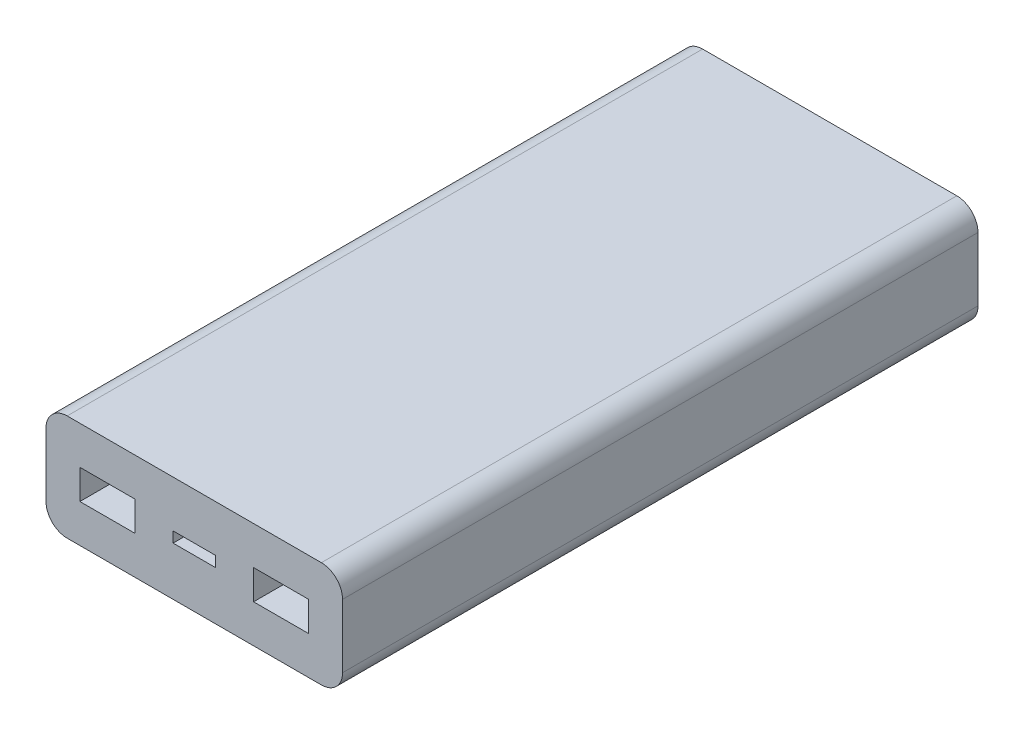
ISO-10303-21;
HEADER;
FILE_DESCRIPTION(('STEP AP214'),'2;1');
FILE_NAME('part.step','',(''),(''),'','','');
FILE_SCHEMA(('AUTOMOTIVE_DESIGN { 1 0 10303 214 1 1 1 1 }'));
ENDSEC;
DATA;
#1=APPLICATION_CONTEXT('core data for automotive mechanical design processes');
#2=APPLICATION_PROTOCOL_DEFINITION('international standard','automotive_design',2000,#1);
#3=PRODUCT_CONTEXT('',#1,'mechanical');
#4=PRODUCT('Part','Part','',(#3));
#5=PRODUCT_RELATED_PRODUCT_CATEGORY('part','',(#4));
#6=PRODUCT_DEFINITION_FORMATION('','',#4);
#7=PRODUCT_DEFINITION_CONTEXT('part definition',#1,'design');
#8=PRODUCT_DEFINITION('design','',#6,#7);
#9=PRODUCT_DEFINITION_SHAPE('','',#8);
#10=(LENGTH_UNIT() NAMED_UNIT(*) SI_UNIT(.MILLI.,.METRE.));
#11=(NAMED_UNIT(*) PLANE_ANGLE_UNIT() SI_UNIT($,.RADIAN.));
#12=(NAMED_UNIT(*) SI_UNIT($,.STERADIAN.) SOLID_ANGLE_UNIT());
#13=UNCERTAINTY_MEASURE_WITH_UNIT(LENGTH_MEASURE(1.E-05),#10,'distance_accuracy_value','');
#14=(GEOMETRIC_REPRESENTATION_CONTEXT(3) GLOBAL_UNCERTAINTY_ASSIGNED_CONTEXT((#13)) GLOBAL_UNIT_ASSIGNED_CONTEXT((#10,
#11,#12)) REPRESENTATION_CONTEXT('',''));
#15=CARTESIAN_POINT('',(0.,0.,0.));
#16=DIRECTION('',(0.,0.,1.));
#17=DIRECTION('',(1.,0.,0.));
#18=AXIS2_PLACEMENT_3D('',#15,#16,#17);
#19=CARTESIAN_POINT('',(0.,0.,150.));
#20=DIRECTION('',(1.,0.,0.));
#21=DIRECTION('',(0.,0.,-1.));
#22=AXIS2_PLACEMENT_3D('',#19,#20,#21);
#23=PLANE('',#22);
#24=DIRECTION('',(0.,-1.,0.));
#25=VECTOR('',#24,1.);
#26=CARTESIAN_POINT('',(0.,0.,0.));
#27=LINE('',#26,#25);
#28=CARTESIAN_POINT('',(0.,20.,0.));
#29=VERTEX_POINT('',#28);
#30=CARTESIAN_POINT('',(0.,5.,0.));
#31=VERTEX_POINT('',#30);
#32=EDGE_CURVE('E208',#29,#31,#27,.T.);
#33=ORIENTED_EDGE('',*,*,#32,.T.);
#34=DIRECTION('',(0.,0.,-1.));
#35=VECTOR('',#34,1.);
#36=CARTESIAN_POINT('',(0.,5.,150.));
#37=LINE('',#36,#35);
#38=CARTESIAN_POINT('',(0.,5.,150.));
#39=VERTEX_POINT('',#38);
#40=EDGE_CURVE('E312',#31,#39,#37,.F.);
#41=ORIENTED_EDGE('',*,*,#40,.T.);
#42=DIRECTION('',(0.,-1.,0.));
#43=VECTOR('',#42,1.);
#44=CARTESIAN_POINT('',(0.,0.,150.));
#45=LINE('',#44,#43);
#46=CARTESIAN_POINT('',(0.,20.,150.));
#47=VERTEX_POINT('',#46);
#48=EDGE_CURVE('E273',#47,#39,#45,.T.);
#49=ORIENTED_EDGE('',*,*,#48,.F.);
#50=DIRECTION('',(0.,0.,-1.));
#51=VECTOR('',#50,1.);
#52=CARTESIAN_POINT('',(0.,20.,150.));
#53=LINE('',#52,#51);
#54=EDGE_CURVE('E309',#47,#29,#53,.T.);
#55=ORIENTED_EDGE('',*,*,#54,.T.);
#56=EDGE_LOOP('',(#33,#41,#49,#55));
#57=FACE_BOUND('',#56,.T.);
#58=ADVANCED_FACE('F35',(#57),#23,.F.);
#59=CARTESIAN_POINT('',(0.,0.,150.));
#60=DIRECTION('',(0.,1.,0.));
#61=DIRECTION('',(0.,0.,1.));
#62=AXIS2_PLACEMENT_3D('',#59,#60,#61);
#63=PLANE('',#62);
#64=DIRECTION('',(1.,0.,0.));
#65=VECTOR('',#64,1.);
#66=CARTESIAN_POINT('',(0.,0.,150.));
#67=LINE('',#66,#65);
#68=CARTESIAN_POINT('',(5.,0.,150.));
#69=VERTEX_POINT('',#68);
#70=CARTESIAN_POINT('',(65.,0.,150.));
#71=VERTEX_POINT('',#70);
#72=EDGE_CURVE('E276',#69,#71,#67,.T.);
#73=ORIENTED_EDGE('',*,*,#72,.F.);
#74=DIRECTION('',(0.,0.,-1.));
#75=VECTOR('',#74,1.);
#76=CARTESIAN_POINT('',(5.,0.,150.));
#77=LINE('',#76,#75);
#78=CARTESIAN_POINT('',(5.,0.,0.));
#79=VERTEX_POINT('',#78);
#80=EDGE_CURVE('E298',#69,#79,#77,.T.);
#81=ORIENTED_EDGE('',*,*,#80,.T.);
#82=DIRECTION('',(1.,0.,0.));
#83=VECTOR('',#82,1.);
#84=CARTESIAN_POINT('',(0.,0.,0.));
#85=LINE('',#84,#83);
#86=CARTESIAN_POINT('',(65.,0.,0.));
#87=VERTEX_POINT('',#86);
#88=EDGE_CURVE('E289',#79,#87,#85,.T.);
#89=ORIENTED_EDGE('',*,*,#88,.T.);
#90=DIRECTION('',(0.,0.,-1.));
#91=VECTOR('',#90,1.);
#92=CARTESIAN_POINT('',(65.,0.,150.));
#93=LINE('',#92,#91);
#94=EDGE_CURVE('E286',#87,#71,#93,.F.);
#95=ORIENTED_EDGE('',*,*,#94,.T.);
#96=EDGE_LOOP('',(#73,#81,#89,#95));
#97=FACE_BOUND('',#96,.T.);
#98=ADVANCED_FACE('F351',(#97),#63,.F.);
#99=CARTESIAN_POINT('',(70.,0.,150.));
#100=DIRECTION('',(-1.,0.,0.));
#101=DIRECTION('',(0.,0.,1.));
#102=AXIS2_PLACEMENT_3D('',#99,#100,#101);
#103=PLANE('',#102);
#104=DIRECTION('',(0.,1.,0.));
#105=VECTOR('',#104,1.);
#106=CARTESIAN_POINT('',(70.,0.,150.));
#107=LINE('',#106,#105);
#108=CARTESIAN_POINT('',(70.,5.,150.));
#109=VERTEX_POINT('',#108);
#110=CARTESIAN_POINT('',(70.,20.,150.));
#111=VERTEX_POINT('',#110);
#112=EDGE_CURVE('E280',#109,#111,#107,.T.);
#113=ORIENTED_EDGE('',*,*,#112,.F.);
#114=DIRECTION('',(0.,0.,-1.));
#115=VECTOR('',#114,1.);
#116=CARTESIAN_POINT('',(70.,5.,150.));
#117=LINE('',#116,#115);
#118=CARTESIAN_POINT('',(70.,5.,0.));
#119=VERTEX_POINT('',#118);
#120=EDGE_CURVE('E324',#109,#119,#117,.T.);
#121=ORIENTED_EDGE('',*,*,#120,.T.);
#122=DIRECTION('',(0.,1.,0.));
#123=VECTOR('',#122,1.);
#124=CARTESIAN_POINT('',(70.,0.,0.));
#125=LINE('',#124,#123);
#126=CARTESIAN_POINT('',(70.,20.,0.));
#127=VERTEX_POINT('',#126);
#128=EDGE_CURVE('E292',#119,#127,#125,.T.);
#129=ORIENTED_EDGE('',*,*,#128,.T.);
#130=DIRECTION('',(0.,0.,-1.));
#131=VECTOR('',#130,1.);
#132=CARTESIAN_POINT('',(70.,20.,150.));
#133=LINE('',#132,#131);
#134=EDGE_CURVE('E322',#127,#111,#133,.F.);
#135=ORIENTED_EDGE('',*,*,#134,.T.);
#136=EDGE_LOOP('',(#113,#121,#129,#135));
#137=FACE_BOUND('',#136,.T.);
#138=ADVANCED_FACE('F360',(#137),#103,.F.);
#139=CARTESIAN_POINT('',(0.,25.,150.));
#140=DIRECTION('',(0.,-1.,0.));
#141=DIRECTION('',(0.,0.,-1.));
#142=AXIS2_PLACEMENT_3D('',#139,#140,#141);
#143=PLANE('',#142);
#144=DIRECTION('',(-1.,0.,0.));
#145=VECTOR('',#144,1.);
#146=CARTESIAN_POINT('',(0.,25.,150.));
#147=LINE('',#146,#145);
#148=CARTESIAN_POINT('',(65.,25.,150.));
#149=VERTEX_POINT('',#148);
#150=CARTESIAN_POINT('',(5.,25.,150.));
#151=VERTEX_POINT('',#150);
#152=EDGE_CURVE('E283',#149,#151,#147,.T.);
#153=ORIENTED_EDGE('',*,*,#152,.F.);
#154=DIRECTION('',(0.,0.,-1.));
#155=VECTOR('',#154,1.);
#156=CARTESIAN_POINT('',(65.,25.,150.));
#157=LINE('',#156,#155);
#158=CARTESIAN_POINT('',(65.,25.,0.));
#159=VERTEX_POINT('',#158);
#160=EDGE_CURVE('E11',#149,#159,#157,.T.);
#161=ORIENTED_EDGE('',*,*,#160,.T.);
#162=DIRECTION('',(-1.,0.,0.));
#163=VECTOR('',#162,1.);
#164=CARTESIAN_POINT('',(0.,25.,0.));
#165=LINE('',#164,#163);
#166=CARTESIAN_POINT('',(5.,25.,0.));
#167=VERTEX_POINT('',#166);
#168=EDGE_CURVE('E277',#159,#167,#165,.T.);
#169=ORIENTED_EDGE('',*,*,#168,.T.);
#170=DIRECTION('',(0.,0.,-1.));
#171=VECTOR('',#170,1.);
#172=CARTESIAN_POINT('',(5.,25.,150.));
#173=LINE('',#172,#171);
#174=EDGE_CURVE('E43',#167,#151,#173,.F.);
#175=ORIENTED_EDGE('',*,*,#174,.T.);
#176=EDGE_LOOP('',(#153,#161,#169,#175));
#177=FACE_BOUND('',#176,.T.);
#178=ADVANCED_FACE('F329',(#177),#143,.F.);
#179=CARTESIAN_POINT('',(0.,0.,150.));
#180=DIRECTION('',(0.,0.,-1.));
#181=DIRECTION('',(-1.,0.,0.));
#182=AXIS2_PLACEMENT_3D('',#179,#180,#181);
#183=PLANE('',#182);
#184=DIRECTION('',(1.,0.,0.));
#185=VECTOR('',#184,1.);
#186=CARTESIAN_POINT('',(8.,9.,150.));
#187=LINE('',#186,#185);
#188=CARTESIAN_POINT('',(8.,9.,150.));
#189=VERTEX_POINT('',#188);
#190=CARTESIAN_POINT('',(21.,9.,150.));
#191=VERTEX_POINT('',#190);
#192=EDGE_CURVE('E201',#189,#191,#187,.T.);
#193=ORIENTED_EDGE('',*,*,#192,.F.);
#194=DIRECTION('',(0.,-1.,0.));
#195=VECTOR('',#194,1.);
#196=CARTESIAN_POINT('',(8.,16.,150.));
#197=LINE('',#196,#195);
#198=CARTESIAN_POINT('',(8.,16.,150.));
#199=VERTEX_POINT('',#198);
#200=EDGE_CURVE('E50',#199,#189,#197,.T.);
#201=ORIENTED_EDGE('',*,*,#200,.F.);
#202=DIRECTION('',(-1.,0.,0.));
#203=VECTOR('',#202,1.);
#204=CARTESIAN_POINT('',(8.,16.,150.));
#205=LINE('',#204,#203);
#206=CARTESIAN_POINT('',(21.,16.,150.));
#207=VERTEX_POINT('',#206);
#208=EDGE_CURVE('E192',#207,#199,#205,.T.);
#209=ORIENTED_EDGE('',*,*,#208,.F.);
#210=DIRECTION('',(0.,1.,0.));
#211=VECTOR('',#210,1.);
#212=CARTESIAN_POINT('',(21.,16.,150.));
#213=LINE('',#212,#211);
#214=EDGE_CURVE('E195',#191,#207,#213,.T.);
#215=ORIENTED_EDGE('',*,*,#214,.F.);
#216=EDGE_LOOP('',(#193,#201,#209,#215));
#217=FACE_BOUND('',#216,.T.);
#218=DIRECTION('',(1.,0.,0.));
#219=VECTOR('',#218,1.);
#220=CARTESIAN_POINT('',(49.,9.,150.));
#221=LINE('',#220,#219);
#222=CARTESIAN_POINT('',(49.,9.,150.));
#223=VERTEX_POINT('',#222);
#224=CARTESIAN_POINT('',(62.,9.,150.));
#225=VERTEX_POINT('',#224);
#226=EDGE_CURVE('E227',#223,#225,#221,.T.);
#227=ORIENTED_EDGE('',*,*,#226,.F.);
#228=DIRECTION('',(0.,-1.,0.));
#229=VECTOR('',#228,1.);
#230=CARTESIAN_POINT('',(49.,16.,150.));
#231=LINE('',#230,#229);
#232=CARTESIAN_POINT('',(49.,16.,150.));
#233=VERTEX_POINT('',#232);
#234=EDGE_CURVE('E58',#233,#223,#231,.T.);
#235=ORIENTED_EDGE('',*,*,#234,.F.);
#236=DIRECTION('',(-1.,0.,0.));
#237=VECTOR('',#236,1.);
#238=CARTESIAN_POINT('',(49.,16.,150.));
#239=LINE('',#238,#237);
#240=CARTESIAN_POINT('',(62.,16.,150.));
#241=VERTEX_POINT('',#240);
#242=EDGE_CURVE('E216',#241,#233,#239,.T.);
#243=ORIENTED_EDGE('',*,*,#242,.F.);
#244=DIRECTION('',(0.,1.,0.));
#245=VECTOR('',#244,1.);
#246=CARTESIAN_POINT('',(62.,16.,150.));
#247=LINE('',#246,#245);
#248=EDGE_CURVE('E231',#225,#241,#247,.T.);
#249=ORIENTED_EDGE('',*,*,#248,.F.);
#250=EDGE_LOOP('',(#227,#235,#243,#249));
#251=FACE_BOUND('',#250,.T.);
#252=DIRECTION('',(1.,0.,0.));
#253=VECTOR('',#252,1.);
#254=CARTESIAN_POINT('',(30.,11.5,150.));
#255=LINE('',#254,#253);
#256=CARTESIAN_POINT('',(30.,11.5,150.));
#257=VERTEX_POINT('',#256);
#258=CARTESIAN_POINT('',(40.,11.5,150.));
#259=VERTEX_POINT('',#258);
#260=EDGE_CURVE('E258',#257,#259,#255,.T.);
#261=ORIENTED_EDGE('',*,*,#260,.F.);
#262=DIRECTION('',(0.,-1.,0.));
#263=VECTOR('',#262,1.);
#264=CARTESIAN_POINT('',(30.,14.,150.));
#265=LINE('',#264,#263);
#266=CARTESIAN_POINT('',(30.,14.,150.));
#267=VERTEX_POINT('',#266);
#268=EDGE_CURVE('E256',#267,#257,#265,.T.);
#269=ORIENTED_EDGE('',*,*,#268,.F.);
#270=DIRECTION('',(-1.,0.,0.));
#271=VECTOR('',#270,1.);
#272=CARTESIAN_POINT('',(30.,14.,150.));
#273=LINE('',#272,#271);
#274=CARTESIAN_POINT('',(40.,14.,150.));
#275=VERTEX_POINT('',#274);
#276=EDGE_CURVE('E246',#275,#267,#273,.T.);
#277=ORIENTED_EDGE('',*,*,#276,.F.);
#278=DIRECTION('',(0.,1.,0.));
#279=VECTOR('',#278,1.);
#280=CARTESIAN_POINT('',(40.,14.,150.));
#281=LINE('',#280,#279);
#282=EDGE_CURVE('E261',#259,#275,#281,.T.);
#283=ORIENTED_EDGE('',*,*,#282,.F.);
#284=EDGE_LOOP('',(#261,#269,#277,#283));
#285=FACE_BOUND('',#284,.T.);
#286=ORIENTED_EDGE('',*,*,#48,.T.);
#287=CARTESIAN_POINT('',(5.,5.,150.));
#288=DIRECTION('',(0.,0.,-1.));
#289=DIRECTION('',(-1.,0.,0.));
#290=AXIS2_PLACEMENT_3D('',#287,#288,#289);
#291=CIRCLE('',#290,5.);
#292=EDGE_CURVE('E320',#39,#69,#291,.F.);
#293=ORIENTED_EDGE('',*,*,#292,.T.);
#294=ORIENTED_EDGE('',*,*,#72,.T.);
#295=CARTESIAN_POINT('',(65.,5.,150.));
#296=DIRECTION('',(0.,0.,-1.));
#297=DIRECTION('',(-1.,0.,0.));
#298=AXIS2_PLACEMENT_3D('',#295,#296,#297);
#299=CIRCLE('',#298,5.);
#300=EDGE_CURVE('E318',#71,#109,#299,.F.);
#301=ORIENTED_EDGE('',*,*,#300,.T.);
#302=ORIENTED_EDGE('',*,*,#112,.T.);
#303=CARTESIAN_POINT('',(65.,20.,150.));
#304=DIRECTION('',(0.,0.,-1.));
#305=DIRECTION('',(-1.,0.,0.));
#306=AXIS2_PLACEMENT_3D('',#303,#304,#305);
#307=CIRCLE('',#306,5.);
#308=EDGE_CURVE('E316',#111,#149,#307,.F.);
#309=ORIENTED_EDGE('',*,*,#308,.T.);
#310=ORIENTED_EDGE('',*,*,#152,.T.);
#311=CARTESIAN_POINT('',(5.,20.,150.));
#312=DIRECTION('',(0.,0.,-1.));
#313=DIRECTION('',(-1.,0.,0.));
#314=AXIS2_PLACEMENT_3D('',#311,#312,#313);
#315=CIRCLE('',#314,5.);
#316=EDGE_CURVE('E314',#151,#47,#315,.F.);
#317=ORIENTED_EDGE('',*,*,#316,.T.);
#318=EDGE_LOOP('',(#286,#293,#294,#301,#302,#309,#310,#317));
#319=FACE_BOUND('',#318,.T.);
#320=ADVANCED_FACE('F335',(#217,#251,#285,#319),#183,.F.);
#321=CARTESIAN_POINT('',(0.,0.,0.));
#322=DIRECTION('',(0.,0.,-1.));
#323=DIRECTION('',(-1.,0.,0.));
#324=AXIS2_PLACEMENT_3D('',#321,#322,#323);
#325=PLANE('',#324);
#326=ORIENTED_EDGE('',*,*,#88,.F.);
#327=CARTESIAN_POINT('',(5.,5.,0.));
#328=DIRECTION('',(0.,0.,-1.));
#329=DIRECTION('',(-1.,0.,0.));
#330=AXIS2_PLACEMENT_3D('',#327,#328,#329);
#331=CIRCLE('',#330,5.);
#332=EDGE_CURVE('E307',#79,#31,#331,.T.);
#333=ORIENTED_EDGE('',*,*,#332,.T.);
#334=ORIENTED_EDGE('',*,*,#32,.F.);
#335=CARTESIAN_POINT('',(5.,20.,0.));
#336=DIRECTION('',(0.,0.,-1.));
#337=DIRECTION('',(-1.,0.,0.));
#338=AXIS2_PLACEMENT_3D('',#335,#336,#337);
#339=CIRCLE('',#338,5.);
#340=EDGE_CURVE('E301',#29,#167,#339,.T.);
#341=ORIENTED_EDGE('',*,*,#340,.T.);
#342=ORIENTED_EDGE('',*,*,#168,.F.);
#343=CARTESIAN_POINT('',(65.,20.,0.));
#344=DIRECTION('',(0.,0.,-1.));
#345=DIRECTION('',(-1.,0.,0.));
#346=AXIS2_PLACEMENT_3D('',#343,#344,#345);
#347=CIRCLE('',#346,5.);
#348=EDGE_CURVE('E303',#159,#127,#347,.T.);
#349=ORIENTED_EDGE('',*,*,#348,.T.);
#350=ORIENTED_EDGE('',*,*,#128,.F.);
#351=CARTESIAN_POINT('',(65.,5.,0.));
#352=DIRECTION('',(0.,0.,-1.));
#353=DIRECTION('',(-1.,0.,0.));
#354=AXIS2_PLACEMENT_3D('',#351,#352,#353);
#355=CIRCLE('',#354,5.);
#356=EDGE_CURVE('E305',#119,#87,#355,.T.);
#357=ORIENTED_EDGE('',*,*,#356,.T.);
#358=EDGE_LOOP('',(#326,#333,#334,#341,#342,#349,#350,#357));
#359=FACE_BOUND('',#358,.T.);
#360=ADVANCED_FACE('F344',(#359),#325,.T.);
#361=CARTESIAN_POINT('',(5.,5.,150.));
#362=DIRECTION('',(0.,0.,-1.));
#363=DIRECTION('',(-1.,0.,0.));
#364=AXIS2_PLACEMENT_3D('',#361,#362,#363);
#365=CYLINDRICAL_SURFACE('',#364,5.);
#366=ORIENTED_EDGE('',*,*,#292,.F.);
#367=ORIENTED_EDGE('',*,*,#40,.F.);
#368=ORIENTED_EDGE('',*,*,#332,.F.);
#369=ORIENTED_EDGE('',*,*,#80,.F.);
#370=EDGE_LOOP('',(#366,#367,#368,#369));
#371=FACE_BOUND('',#370,.T.);
#372=ADVANCED_FACE('F348',(#371),#365,.T.);
#373=CARTESIAN_POINT('',(65.,5.,150.));
#374=DIRECTION('',(0.,0.,-1.));
#375=DIRECTION('',(-1.,0.,0.));
#376=AXIS2_PLACEMENT_3D('',#373,#374,#375);
#377=CYLINDRICAL_SURFACE('',#376,5.);
#378=ORIENTED_EDGE('',*,*,#300,.F.);
#379=ORIENTED_EDGE('',*,*,#94,.F.);
#380=ORIENTED_EDGE('',*,*,#356,.F.);
#381=ORIENTED_EDGE('',*,*,#120,.F.);
#382=EDGE_LOOP('',(#378,#379,#380,#381));
#383=FACE_BOUND('',#382,.T.);
#384=ADVANCED_FACE('F357',(#383),#377,.T.);
#385=CARTESIAN_POINT('',(65.,20.,150.));
#386=DIRECTION('',(0.,0.,-1.));
#387=DIRECTION('',(-1.,0.,0.));
#388=AXIS2_PLACEMENT_3D('',#385,#386,#387);
#389=CYLINDRICAL_SURFACE('',#388,5.);
#390=ORIENTED_EDGE('',*,*,#308,.F.);
#391=ORIENTED_EDGE('',*,*,#134,.F.);
#392=ORIENTED_EDGE('',*,*,#348,.F.);
#393=ORIENTED_EDGE('',*,*,#160,.F.);
#394=EDGE_LOOP('',(#390,#391,#392,#393));
#395=FACE_BOUND('',#394,.T.);
#396=ADVANCED_FACE('F363',(#395),#389,.T.);
#397=CARTESIAN_POINT('',(5.,20.,150.));
#398=DIRECTION('',(0.,0.,-1.));
#399=DIRECTION('',(-1.,0.,0.));
#400=AXIS2_PLACEMENT_3D('',#397,#398,#399);
#401=CYLINDRICAL_SURFACE('',#400,5.);
#402=ORIENTED_EDGE('',*,*,#316,.F.);
#403=ORIENTED_EDGE('',*,*,#174,.F.);
#404=ORIENTED_EDGE('',*,*,#340,.F.);
#405=ORIENTED_EDGE('',*,*,#54,.F.);
#406=EDGE_LOOP('',(#402,#403,#404,#405));
#407=FACE_BOUND('',#406,.T.);
#408=ADVANCED_FACE('F37',(#407),#401,.T.);
#409=CARTESIAN_POINT('',(30.,14.,138.5));
#410=DIRECTION('',(-1.,0.,0.));
#411=DIRECTION('',(0.,0.,1.));
#412=AXIS2_PLACEMENT_3D('',#409,#410,#411);
#413=PLANE('',#412);
#414=ORIENTED_EDGE('',*,*,#268,.T.);
#415=DIRECTION('',(0.,0.,1.));
#416=VECTOR('',#415,1.);
#417=CARTESIAN_POINT('',(30.,11.5,138.5));
#418=LINE('',#417,#416);
#419=CARTESIAN_POINT('',(30.,11.5,138.5));
#420=VERTEX_POINT('',#419);
#421=EDGE_CURVE('E255',#420,#257,#418,.T.);
#422=ORIENTED_EDGE('',*,*,#421,.F.);
#423=DIRECTION('',(0.,-1.,0.));
#424=VECTOR('',#423,1.);
#425=CARTESIAN_POINT('',(30.,14.,138.5));
#426=LINE('',#425,#424);
#427=CARTESIAN_POINT('',(30.,14.,138.5));
#428=VERTEX_POINT('',#427);
#429=EDGE_CURVE('E242',#428,#420,#426,.T.);
#430=ORIENTED_EDGE('',*,*,#429,.F.);
#431=DIRECTION('',(0.,0.,1.));
#432=VECTOR('',#431,1.);
#433=CARTESIAN_POINT('',(30.,14.,138.5));
#434=LINE('',#433,#432);
#435=EDGE_CURVE('E228',#428,#267,#434,.T.);
#436=ORIENTED_EDGE('',*,*,#435,.T.);
#437=EDGE_LOOP('',(#414,#422,#430,#436));
#438=FACE_BOUND('',#437,.T.);
#439=ADVANCED_FACE('F369',(#438),#413,.F.);
#440=CARTESIAN_POINT('',(30.,14.,138.5));
#441=DIRECTION('',(0.,1.,0.));
#442=DIRECTION('',(0.,0.,1.));
#443=AXIS2_PLACEMENT_3D('',#440,#441,#442);
#444=PLANE('',#443);
#445=ORIENTED_EDGE('',*,*,#276,.T.);
#446=ORIENTED_EDGE('',*,*,#435,.F.);
#447=DIRECTION('',(-1.,0.,0.));
#448=VECTOR('',#447,1.);
#449=CARTESIAN_POINT('',(30.,14.,138.5));
#450=LINE('',#449,#448);
#451=CARTESIAN_POINT('',(40.,14.,138.5));
#452=VERTEX_POINT('',#451);
#453=EDGE_CURVE('E252',#452,#428,#450,.T.);
#454=ORIENTED_EDGE('',*,*,#453,.F.);
#455=DIRECTION('',(0.,0.,1.));
#456=VECTOR('',#455,1.);
#457=CARTESIAN_POINT('',(40.,14.,138.5));
#458=LINE('',#457,#456);
#459=EDGE_CURVE('E267',#452,#275,#458,.T.);
#460=ORIENTED_EDGE('',*,*,#459,.T.);
#461=EDGE_LOOP('',(#445,#446,#454,#460));
#462=FACE_BOUND('',#461,.T.);
#463=ADVANCED_FACE('F418',(#462),#444,.F.);
#464=CARTESIAN_POINT('',(40.,14.,138.5));
#465=DIRECTION('',(1.,0.,0.));
#466=DIRECTION('',(0.,0.,-1.));
#467=AXIS2_PLACEMENT_3D('',#464,#465,#466);
#468=PLANE('',#467);
#469=ORIENTED_EDGE('',*,*,#282,.T.);
#470=ORIENTED_EDGE('',*,*,#459,.F.);
#471=DIRECTION('',(0.,1.,0.));
#472=VECTOR('',#471,1.);
#473=CARTESIAN_POINT('',(40.,14.,138.5));
#474=LINE('',#473,#472);
#475=CARTESIAN_POINT('',(40.,11.5,138.5));
#476=VERTEX_POINT('',#475);
#477=EDGE_CURVE('E249',#476,#452,#474,.T.);
#478=ORIENTED_EDGE('',*,*,#477,.F.);
#479=DIRECTION('',(0.,0.,1.));
#480=VECTOR('',#479,1.);
#481=CARTESIAN_POINT('',(40.,11.5,138.5));
#482=LINE('',#481,#480);
#483=EDGE_CURVE('E269',#476,#259,#482,.T.);
#484=ORIENTED_EDGE('',*,*,#483,.T.);
#485=EDGE_LOOP('',(#469,#470,#478,#484));
#486=FACE_BOUND('',#485,.T.);
#487=ADVANCED_FACE('F427',(#486),#468,.F.);
#488=CARTESIAN_POINT('',(30.,11.5,138.5));
#489=DIRECTION('',(0.,-1.,0.));
#490=DIRECTION('',(1.,0.,0.));
#491=AXIS2_PLACEMENT_3D('',#488,#489,#490);
#492=PLANE('',#491);
#493=ORIENTED_EDGE('',*,*,#260,.T.);
#494=ORIENTED_EDGE('',*,*,#483,.F.);
#495=DIRECTION('',(1.,0.,0.));
#496=VECTOR('',#495,1.);
#497=CARTESIAN_POINT('',(30.,11.5,138.5));
#498=LINE('',#497,#496);
#499=EDGE_CURVE('E245',#420,#476,#498,.T.);
#500=ORIENTED_EDGE('',*,*,#499,.F.);
#501=ORIENTED_EDGE('',*,*,#421,.T.);
#502=EDGE_LOOP('',(#493,#494,#500,#501));
#503=FACE_BOUND('',#502,.T.);
#504=ADVANCED_FACE('F437',(#503),#492,.F.);
#505=CARTESIAN_POINT('',(0.,0.,138.5));
#506=DIRECTION('',(0.,0.,1.));
#507=DIRECTION('',(1.,0.,0.));
#508=AXIS2_PLACEMENT_3D('',#505,#506,#507);
#509=PLANE('',#508);
#510=ORIENTED_EDGE('',*,*,#429,.T.);
#511=ORIENTED_EDGE('',*,*,#499,.T.);
#512=ORIENTED_EDGE('',*,*,#477,.T.);
#513=ORIENTED_EDGE('',*,*,#453,.T.);
#514=EDGE_LOOP('',(#510,#511,#512,#513));
#515=FACE_BOUND('',#514,.T.);
#516=ADVANCED_FACE('F447',(#515),#509,.T.);
#517=CARTESIAN_POINT('',(49.,16.,138.5));
#518=DIRECTION('',(-1.,0.,0.));
#519=DIRECTION('',(0.,0.,1.));
#520=AXIS2_PLACEMENT_3D('',#517,#518,#519);
#521=PLANE('',#520);
#522=ORIENTED_EDGE('',*,*,#234,.T.);
#523=DIRECTION('',(0.,0.,1.));
#524=VECTOR('',#523,1.);
#525=CARTESIAN_POINT('',(49.,9.,138.5));
#526=LINE('',#525,#524);
#527=CARTESIAN_POINT('',(49.,9.,138.5));
#528=VERTEX_POINT('',#527);
#529=EDGE_CURVE('E225',#528,#223,#526,.T.);
#530=ORIENTED_EDGE('',*,*,#529,.F.);
#531=DIRECTION('',(0.,-1.,0.));
#532=VECTOR('',#531,1.);
#533=CARTESIAN_POINT('',(49.,16.,138.5));
#534=LINE('',#533,#532);
#535=CARTESIAN_POINT('',(49.,16.,138.5));
#536=VERTEX_POINT('',#535);
#537=EDGE_CURVE('E212',#536,#528,#534,.T.);
#538=ORIENTED_EDGE('',*,*,#537,.F.);
#539=DIRECTION('',(0.,0.,1.));
#540=VECTOR('',#539,1.);
#541=CARTESIAN_POINT('',(49.,16.,138.5));
#542=LINE('',#541,#540);
#543=EDGE_CURVE('E202',#536,#233,#542,.T.);
#544=ORIENTED_EDGE('',*,*,#543,.T.);
#545=EDGE_LOOP('',(#522,#530,#538,#544));
#546=FACE_BOUND('',#545,.T.);
#547=ADVANCED_FACE('F457',(#546),#521,.F.);
#548=CARTESIAN_POINT('',(49.,16.,138.5));
#549=DIRECTION('',(0.,1.,0.));
#550=DIRECTION('',(0.,0.,1.));
#551=AXIS2_PLACEMENT_3D('',#548,#549,#550);
#552=PLANE('',#551);
#553=ORIENTED_EDGE('',*,*,#242,.T.);
#554=ORIENTED_EDGE('',*,*,#543,.F.);
#555=DIRECTION('',(-1.,0.,0.));
#556=VECTOR('',#555,1.);
#557=CARTESIAN_POINT('',(49.,16.,138.5));
#558=LINE('',#557,#556);
#559=CARTESIAN_POINT('',(62.,16.,138.5));
#560=VERTEX_POINT('',#559);
#561=EDGE_CURVE('E222',#560,#536,#558,.T.);
#562=ORIENTED_EDGE('',*,*,#561,.F.);
#563=DIRECTION('',(0.,0.,1.));
#564=VECTOR('',#563,1.);
#565=CARTESIAN_POINT('',(62.,16.,138.5));
#566=LINE('',#565,#564);
#567=EDGE_CURVE('E237',#560,#241,#566,.T.);
#568=ORIENTED_EDGE('',*,*,#567,.T.);
#569=EDGE_LOOP('',(#553,#554,#562,#568));
#570=FACE_BOUND('',#569,.T.);
#571=ADVANCED_FACE('F467',(#570),#552,.F.);
#572=CARTESIAN_POINT('',(62.,16.,138.5));
#573=DIRECTION('',(1.,0.,0.));
#574=DIRECTION('',(0.,0.,-1.));
#575=AXIS2_PLACEMENT_3D('',#572,#573,#574);
#576=PLANE('',#575);
#577=ORIENTED_EDGE('',*,*,#248,.T.);
#578=ORIENTED_EDGE('',*,*,#567,.F.);
#579=DIRECTION('',(0.,1.,0.));
#580=VECTOR('',#579,1.);
#581=CARTESIAN_POINT('',(62.,16.,138.5));
#582=LINE('',#581,#580);
#583=CARTESIAN_POINT('',(62.,9.,138.5));
#584=VERTEX_POINT('',#583);
#585=EDGE_CURVE('E219',#584,#560,#582,.T.);
#586=ORIENTED_EDGE('',*,*,#585,.F.);
#587=DIRECTION('',(0.,0.,1.));
#588=VECTOR('',#587,1.);
#589=CARTESIAN_POINT('',(62.,9.,138.5));
#590=LINE('',#589,#588);
#591=EDGE_CURVE('E239',#584,#225,#590,.T.);
#592=ORIENTED_EDGE('',*,*,#591,.T.);
#593=EDGE_LOOP('',(#577,#578,#586,#592));
#594=FACE_BOUND('',#593,.T.);
#595=ADVANCED_FACE('F476',(#594),#576,.F.);
#596=CARTESIAN_POINT('',(49.,9.,138.5));
#597=DIRECTION('',(0.,-1.,0.));
#598=DIRECTION('',(0.,0.,-1.));
#599=AXIS2_PLACEMENT_3D('',#596,#597,#598);
#600=PLANE('',#599);
#601=ORIENTED_EDGE('',*,*,#226,.T.);
#602=ORIENTED_EDGE('',*,*,#591,.F.);
#603=DIRECTION('',(1.,0.,0.));
#604=VECTOR('',#603,1.);
#605=CARTESIAN_POINT('',(49.,9.,138.5));
#606=LINE('',#605,#604);
#607=EDGE_CURVE('E215',#528,#584,#606,.T.);
#608=ORIENTED_EDGE('',*,*,#607,.F.);
#609=ORIENTED_EDGE('',*,*,#529,.T.);
#610=EDGE_LOOP('',(#601,#602,#608,#609));
#611=FACE_BOUND('',#610,.T.);
#612=ADVANCED_FACE('F486',(#611),#600,.F.);
#613=CARTESIAN_POINT('',(0.,0.,138.5));
#614=DIRECTION('',(0.,0.,1.));
#615=DIRECTION('',(1.,0.,0.));
#616=AXIS2_PLACEMENT_3D('',#613,#614,#615);
#617=PLANE('',#616);
#618=ORIENTED_EDGE('',*,*,#537,.T.);
#619=ORIENTED_EDGE('',*,*,#607,.T.);
#620=ORIENTED_EDGE('',*,*,#585,.T.);
#621=ORIENTED_EDGE('',*,*,#561,.T.);
#622=EDGE_LOOP('',(#618,#619,#620,#621));
#623=FACE_BOUND('',#622,.T.);
#624=ADVANCED_FACE('F496',(#623),#617,.T.);
#625=CARTESIAN_POINT('',(8.,16.,138.5));
#626=DIRECTION('',(-1.,0.,0.));
#627=DIRECTION('',(0.,-1.,0.));
#628=AXIS2_PLACEMENT_3D('',#625,#626,#627);
#629=PLANE('',#628);
#630=ORIENTED_EDGE('',*,*,#200,.T.);
#631=DIRECTION('',(0.,0.,1.));
#632=VECTOR('',#631,1.);
#633=CARTESIAN_POINT('',(8.,9.,138.5));
#634=LINE('',#633,#632);
#635=CARTESIAN_POINT('',(8.,9.,138.5));
#636=VERTEX_POINT('',#635);
#637=EDGE_CURVE('E170',#636,#189,#634,.T.);
#638=ORIENTED_EDGE('',*,*,#637,.F.);
#639=DIRECTION('',(0.,-1.,0.));
#640=VECTOR('',#639,1.);
#641=CARTESIAN_POINT('',(8.,16.,138.5));
#642=LINE('',#641,#640);
#643=CARTESIAN_POINT('',(8.,16.,138.5));
#644=VERTEX_POINT('',#643);
#645=EDGE_CURVE('E174',#644,#636,#642,.T.);
#646=ORIENTED_EDGE('',*,*,#645,.F.);
#647=DIRECTION('',(0.,0.,1.));
#648=VECTOR('',#647,1.);
#649=CARTESIAN_POINT('',(8.,16.,138.5));
#650=LINE('',#649,#648);
#651=EDGE_CURVE('E206',#644,#199,#650,.T.);
#652=ORIENTED_EDGE('',*,*,#651,.T.);
#653=EDGE_LOOP('',(#630,#638,#646,#652));
#654=FACE_BOUND('',#653,.T.);
#655=ADVANCED_FACE('F172',(#654),#629,.F.);
#656=CARTESIAN_POINT('',(8.,16.,138.5));
#657=DIRECTION('',(0.,1.,0.));
#658=DIRECTION('',(0.,0.,1.));
#659=AXIS2_PLACEMENT_3D('',#656,#657,#658);
#660=PLANE('',#659);
#661=ORIENTED_EDGE('',*,*,#208,.T.);
#662=ORIENTED_EDGE('',*,*,#651,.F.);
#663=DIRECTION('',(-1.,0.,0.));
#664=VECTOR('',#663,1.);
#665=CARTESIAN_POINT('',(8.,16.,138.5));
#666=LINE('',#665,#664);
#667=CARTESIAN_POINT('',(21.,16.,138.5));
#668=VERTEX_POINT('',#667);
#669=EDGE_CURVE('E180',#668,#644,#666,.T.);
#670=ORIENTED_EDGE('',*,*,#669,.F.);
#671=DIRECTION('',(0.,0.,1.));
#672=VECTOR('',#671,1.);
#673=CARTESIAN_POINT('',(21.,16.,138.5));
#674=LINE('',#673,#672);
#675=EDGE_CURVE('E209',#668,#207,#674,.T.);
#676=ORIENTED_EDGE('',*,*,#675,.T.);
#677=EDGE_LOOP('',(#661,#662,#670,#676));
#678=FACE_BOUND('',#677,.T.);
#679=ADVANCED_FACE('F515',(#678),#660,.F.);
#680=CARTESIAN_POINT('',(21.,16.,138.5));
#681=DIRECTION('',(1.,0.,0.));
#682=DIRECTION('',(0.,1.,0.));
#683=AXIS2_PLACEMENT_3D('',#680,#681,#682);
#684=PLANE('',#683);
#685=ORIENTED_EDGE('',*,*,#214,.T.);
#686=ORIENTED_EDGE('',*,*,#675,.F.);
#687=DIRECTION('',(0.,1.,0.));
#688=VECTOR('',#687,1.);
#689=CARTESIAN_POINT('',(21.,16.,138.5));
#690=LINE('',#689,#688);
#691=CARTESIAN_POINT('',(21.,9.,138.5));
#692=VERTEX_POINT('',#691);
#693=EDGE_CURVE('E188',#692,#668,#690,.T.);
#694=ORIENTED_EDGE('',*,*,#693,.F.);
#695=DIRECTION('',(0.,0.,1.));
#696=VECTOR('',#695,1.);
#697=CARTESIAN_POINT('',(21.,9.,138.5));
#698=LINE('',#697,#696);
#699=EDGE_CURVE('E179',#692,#191,#698,.T.);
#700=ORIENTED_EDGE('',*,*,#699,.T.);
#701=EDGE_LOOP('',(#685,#686,#694,#700));
#702=FACE_BOUND('',#701,.T.);
#703=ADVANCED_FACE('F524',(#702),#684,.F.);
#704=CARTESIAN_POINT('',(8.,9.,138.5));
#705=DIRECTION('',(0.,-1.,0.));
#706=DIRECTION('',(0.,0.,-1.));
#707=AXIS2_PLACEMENT_3D('',#704,#705,#706);
#708=PLANE('',#707);
#709=ORIENTED_EDGE('',*,*,#192,.T.);
#710=ORIENTED_EDGE('',*,*,#699,.F.);
#711=DIRECTION('',(1.,0.,0.));
#712=VECTOR('',#711,1.);
#713=CARTESIAN_POINT('',(8.,9.,138.5));
#714=LINE('',#713,#712);
#715=EDGE_CURVE('E183',#636,#692,#714,.T.);
#716=ORIENTED_EDGE('',*,*,#715,.F.);
#717=ORIENTED_EDGE('',*,*,#637,.T.);
#718=EDGE_LOOP('',(#709,#710,#716,#717));
#719=FACE_BOUND('',#718,.T.);
#720=ADVANCED_FACE('F184',(#719),#708,.F.);
#721=CARTESIAN_POINT('',(0.,0.,138.5));
#722=DIRECTION('',(0.,0.,1.));
#723=DIRECTION('',(1.,0.,0.));
#724=AXIS2_PLACEMENT_3D('',#721,#722,#723);
#725=PLANE('',#724);
#726=ORIENTED_EDGE('',*,*,#645,.T.);
#727=ORIENTED_EDGE('',*,*,#715,.T.);
#728=ORIENTED_EDGE('',*,*,#693,.T.);
#729=ORIENTED_EDGE('',*,*,#669,.T.);
#730=EDGE_LOOP('',(#726,#727,#728,#729));
#731=FACE_BOUND('',#730,.T.);
#732=ADVANCED_FACE('F190',(#731),#725,.T.);
#733=CLOSED_SHELL('',(#58,#98,#138,#178,#320,#360,#372,#384,#396,#408,#439,#463,#487,#504,#516,
#547,#571,#595,#612,#624,#655,#679,#703,#720,#732));
#734=MANIFOLD_SOLID_BREP('B2',#733);
#735=ADVANCED_BREP_SHAPE_REPRESENTATION('',(#18,#734),#14);
#736=SHAPE_DEFINITION_REPRESENTATION(#9,#735);
ENDSEC;
END-ISO-10303-21;
